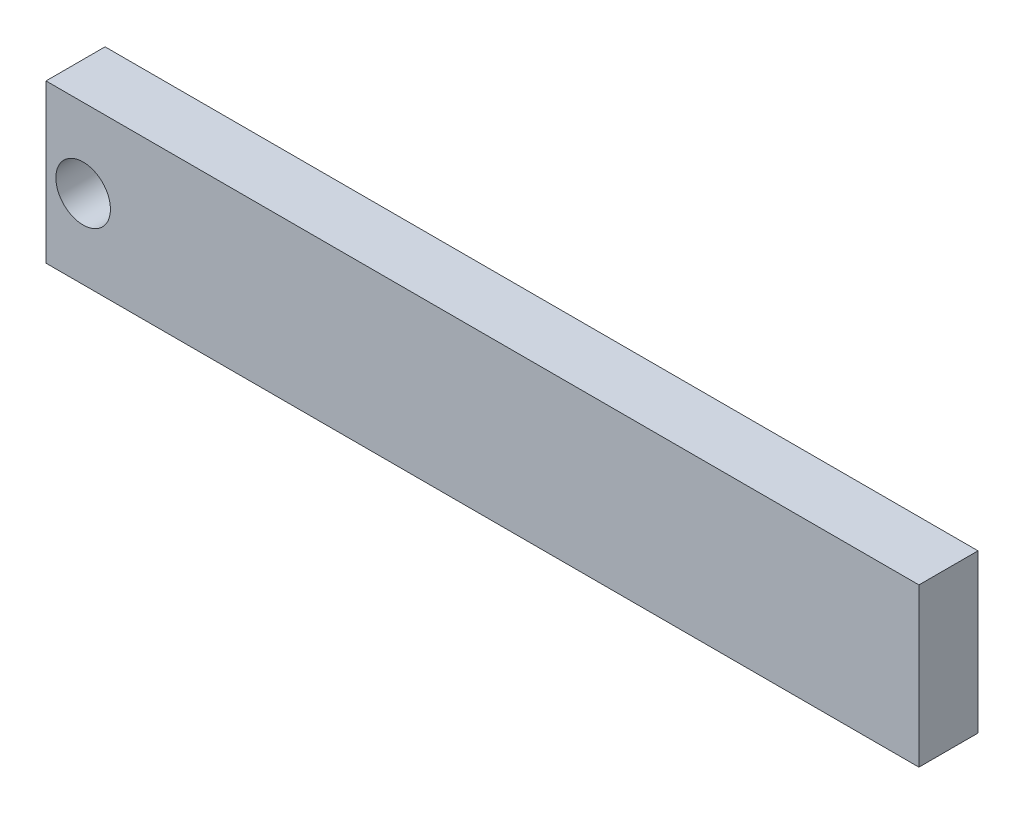
ISO-10303-21;
HEADER;
FILE_DESCRIPTION(('STEP AP214'),'2;1');
FILE_NAME('part.step','',(''),(''),'','','');
FILE_SCHEMA(('AUTOMOTIVE_DESIGN { 1 0 10303 214 1 1 1 1 }'));
ENDSEC;
DATA;
#1=APPLICATION_CONTEXT('core data for automotive mechanical design processes');
#2=APPLICATION_PROTOCOL_DEFINITION('international standard','automotive_design',2000,#1);
#3=PRODUCT_CONTEXT('',#1,'mechanical');
#4=PRODUCT('Part','Part','',(#3));
#5=PRODUCT_RELATED_PRODUCT_CATEGORY('part','',(#4));
#6=PRODUCT_DEFINITION_FORMATION('','',#4);
#7=PRODUCT_DEFINITION_CONTEXT('part definition',#1,'design');
#8=PRODUCT_DEFINITION('design','',#6,#7);
#9=PRODUCT_DEFINITION_SHAPE('','',#8);
#10=(LENGTH_UNIT() NAMED_UNIT(*) SI_UNIT(.MILLI.,.METRE.));
#11=(NAMED_UNIT(*) PLANE_ANGLE_UNIT() SI_UNIT($,.RADIAN.));
#12=(NAMED_UNIT(*) SI_UNIT($,.STERADIAN.) SOLID_ANGLE_UNIT());
#13=UNCERTAINTY_MEASURE_WITH_UNIT(LENGTH_MEASURE(1.E-05),#10,'distance_accuracy_value','');
#14=(GEOMETRIC_REPRESENTATION_CONTEXT(3) GLOBAL_UNCERTAINTY_ASSIGNED_CONTEXT((#13)) GLOBAL_UNIT_ASSIGNED_CONTEXT((#10,
#11,#12)) REPRESENTATION_CONTEXT('',''));
#15=CARTESIAN_POINT('',(0.,0.,0.));
#16=DIRECTION('',(0.,0.,1.));
#17=DIRECTION('',(1.,0.,0.));
#18=AXIS2_PLACEMENT_3D('',#15,#16,#17);
#19=CARTESIAN_POINT('',(0.,0.,3.18));
#20=DIRECTION('',(0.,0.,-1.));
#21=DIRECTION('',(-1.,0.,0.));
#22=AXIS2_PLACEMENT_3D('',#19,#20,#21);
#23=PLANE('',#22);
#24=DIRECTION('',(0.,-1.,0.));
#25=VECTOR('',#24,1.);
#26=CARTESIAN_POINT('',(0.,0.,3.18));
#27=LINE('',#26,#25);
#28=CARTESIAN_POINT('',(0.,8.5,3.18));
#29=VERTEX_POINT('',#28);
#30=CARTESIAN_POINT('',(0.,0.,3.18));
#31=VERTEX_POINT('',#30);
#32=EDGE_CURVE('E85',#29,#31,#27,.T.);
#33=ORIENTED_EDGE('',*,*,#32,.T.);
#34=DIRECTION('',(1.,0.,0.));
#35=VECTOR('',#34,1.);
#36=CARTESIAN_POINT('',(0.,0.,3.18));
#37=LINE('',#36,#35);
#38=CARTESIAN_POINT('',(47.,0.,3.18));
#39=VERTEX_POINT('',#38);
#40=EDGE_CURVE('E80',#31,#39,#37,.T.);
#41=ORIENTED_EDGE('',*,*,#40,.T.);
#42=DIRECTION('',(0.,1.,0.));
#43=VECTOR('',#42,1.);
#44=CARTESIAN_POINT('',(47.,0.,3.18));
#45=LINE('',#44,#43);
#46=CARTESIAN_POINT('',(47.,8.50000000000001,3.18));
#47=VERTEX_POINT('',#46);
#48=EDGE_CURVE('E83',#39,#47,#45,.T.);
#49=ORIENTED_EDGE('',*,*,#48,.T.);
#50=DIRECTION('',(-1.,0.,0.));
#51=VECTOR('',#50,1.);
#52=CARTESIAN_POINT('',(0.,8.5,3.18));
#53=LINE('',#52,#51);
#54=EDGE_CURVE('E50',#47,#29,#53,.T.);
#55=ORIENTED_EDGE('',*,*,#54,.T.);
#56=EDGE_LOOP('',(#33,#41,#49,#55));
#57=FACE_BOUND('',#56,.T.);
#58=CARTESIAN_POINT('',(2.,4.25,3.18));
#59=DIRECTION('',(0.,0.,1.));
#60=DIRECTION('',(1.,0.,0.));
#61=AXIS2_PLACEMENT_3D('',#58,#59,#60);
#62=CIRCLE('',#61,1.47);
#63=CARTESIAN_POINT('',(0.53,4.25,3.18));
#64=VERTEX_POINT('',#63);
#65=EDGE_CURVE('E100',#64,#64,#62,.T.);
#66=ORIENTED_EDGE('',*,*,#65,.F.);
#67=EDGE_LOOP('',(#66));
#68=FACE_BOUND('',#67,.T.);
#69=ADVANCED_FACE('F33',(#57,#68),#23,.F.);
#70=CARTESIAN_POINT('',(0.,0.,0.));
#71=DIRECTION('',(0.,0.,-1.));
#72=DIRECTION('',(-1.,0.,0.));
#73=AXIS2_PLACEMENT_3D('',#70,#71,#72);
#74=PLANE('',#73);
#75=DIRECTION('',(0.,-1.,0.));
#76=VECTOR('',#75,1.);
#77=CARTESIAN_POINT('',(0.,0.,0.));
#78=LINE('',#77,#76);
#79=CARTESIAN_POINT('',(0.,8.5,0.));
#80=VERTEX_POINT('',#79);
#81=CARTESIAN_POINT('',(0.,0.,0.));
#82=VERTEX_POINT('',#81);
#83=EDGE_CURVE('E97',#80,#82,#78,.T.);
#84=ORIENTED_EDGE('',*,*,#83,.F.);
#85=DIRECTION('',(-1.,0.,0.));
#86=VECTOR('',#85,1.);
#87=CARTESIAN_POINT('',(0.,8.5,0.));
#88=LINE('',#87,#86);
#89=CARTESIAN_POINT('',(47.,8.50000000000001,0.));
#90=VERTEX_POINT('',#89);
#91=EDGE_CURVE('E73',#90,#80,#88,.T.);
#92=ORIENTED_EDGE('',*,*,#91,.F.);
#93=DIRECTION('',(0.,1.,0.));
#94=VECTOR('',#93,1.);
#95=CARTESIAN_POINT('',(47.,0.,0.));
#96=LINE('',#95,#94);
#97=CARTESIAN_POINT('',(47.,0.,0.));
#98=VERTEX_POINT('',#97);
#99=EDGE_CURVE('E67',#98,#90,#96,.T.);
#100=ORIENTED_EDGE('',*,*,#99,.F.);
#101=DIRECTION('',(1.,0.,0.));
#102=VECTOR('',#101,1.);
#103=CARTESIAN_POINT('',(0.,0.,0.));
#104=LINE('',#103,#102);
#105=EDGE_CURVE('E89',#82,#98,#104,.T.);
#106=ORIENTED_EDGE('',*,*,#105,.F.);
#107=EDGE_LOOP('',(#84,#92,#100,#106));
#108=FACE_BOUND('',#107,.T.);
#109=CARTESIAN_POINT('',(2.,4.25,0.));
#110=DIRECTION('',(0.,0.,1.));
#111=DIRECTION('',(1.,0.,0.));
#112=AXIS2_PLACEMENT_3D('',#109,#110,#111);
#113=CIRCLE('',#112,1.47);
#114=CARTESIAN_POINT('',(0.53,4.25,0.));
#115=VERTEX_POINT('',#114);
#116=EDGE_CURVE('E112',#115,#115,#113,.T.);
#117=ORIENTED_EDGE('',*,*,#116,.T.);
#118=EDGE_LOOP('',(#117));
#119=FACE_BOUND('',#118,.T.);
#120=ADVANCED_FACE('F108',(#108,#119),#74,.T.);
#121=CARTESIAN_POINT('',(0.,0.,3.18));
#122=DIRECTION('',(1.,0.,0.));
#123=DIRECTION('',(0.,1.,0.));
#124=AXIS2_PLACEMENT_3D('',#121,#122,#123);
#125=PLANE('',#124);
#126=ORIENTED_EDGE('',*,*,#83,.T.);
#127=DIRECTION('',(0.,0.,-1.));
#128=VECTOR('',#127,1.);
#129=CARTESIAN_POINT('',(0.,0.,3.18));
#130=LINE('',#129,#128);
#131=EDGE_CURVE('E11',#31,#82,#130,.T.);
#132=ORIENTED_EDGE('',*,*,#131,.F.);
#133=ORIENTED_EDGE('',*,*,#32,.F.);
#134=DIRECTION('',(0.,0.,-1.));
#135=VECTOR('',#134,1.);
#136=CARTESIAN_POINT('',(0.,8.5,3.18));
#137=LINE('',#136,#135);
#138=EDGE_CURVE('E93',#29,#80,#137,.T.);
#139=ORIENTED_EDGE('',*,*,#138,.T.);
#140=EDGE_LOOP('',(#126,#132,#133,#139));
#141=FACE_BOUND('',#140,.T.);
#142=ADVANCED_FACE('F35',(#141),#125,.F.);
#143=CARTESIAN_POINT('',(0.,0.,3.18));
#144=DIRECTION('',(0.,1.,0.));
#145=DIRECTION('',(0.,0.,1.));
#146=AXIS2_PLACEMENT_3D('',#143,#144,#145);
#147=PLANE('',#146);
#148=ORIENTED_EDGE('',*,*,#105,.T.);
#149=DIRECTION('',(0.,0.,-1.));
#150=VECTOR('',#149,1.);
#151=CARTESIAN_POINT('',(47.,0.,3.18));
#152=LINE('',#151,#150);
#153=EDGE_CURVE('E42',#39,#98,#152,.T.);
#154=ORIENTED_EDGE('',*,*,#153,.F.);
#155=ORIENTED_EDGE('',*,*,#40,.F.);
#156=ORIENTED_EDGE('',*,*,#131,.T.);
#157=EDGE_LOOP('',(#148,#154,#155,#156));
#158=FACE_BOUND('',#157,.T.);
#159=ADVANCED_FACE('F88',(#158),#147,.F.);
#160=CARTESIAN_POINT('',(47.,0.,3.18));
#161=DIRECTION('',(-1.,0.,0.));
#162=DIRECTION('',(0.,0.,1.));
#163=AXIS2_PLACEMENT_3D('',#160,#161,#162);
#164=PLANE('',#163);
#165=ORIENTED_EDGE('',*,*,#99,.T.);
#166=DIRECTION('',(0.,0.,-1.));
#167=VECTOR('',#166,1.);
#168=CARTESIAN_POINT('',(47.,8.50000000000001,3.18));
#169=LINE('',#168,#167);
#170=EDGE_CURVE('E90',#47,#90,#169,.T.);
#171=ORIENTED_EDGE('',*,*,#170,.F.);
#172=ORIENTED_EDGE('',*,*,#48,.F.);
#173=ORIENTED_EDGE('',*,*,#153,.T.);
#174=EDGE_LOOP('',(#165,#171,#172,#173));
#175=FACE_BOUND('',#174,.T.);
#176=ADVANCED_FACE('F91',(#175),#164,.F.);
#177=CARTESIAN_POINT('',(0.,8.5,3.18));
#178=DIRECTION('',(0.,-1.,0.));
#179=DIRECTION('',(1.,0.,0.));
#180=AXIS2_PLACEMENT_3D('',#177,#178,#179);
#181=PLANE('',#180);
#182=ORIENTED_EDGE('',*,*,#91,.T.);
#183=ORIENTED_EDGE('',*,*,#138,.F.);
#184=ORIENTED_EDGE('',*,*,#54,.F.);
#185=ORIENTED_EDGE('',*,*,#170,.T.);
#186=EDGE_LOOP('',(#182,#183,#184,#185));
#187=FACE_BOUND('',#186,.T.);
#188=ADVANCED_FACE('F105',(#187),#181,.F.);
#189=CARTESIAN_POINT('',(2.,4.25,3.18));
#190=DIRECTION('',(0.,0.,-1.));
#191=DIRECTION('',(-1.,0.,0.));
#192=AXIS2_PLACEMENT_3D('',#189,#190,#191);
#193=CYLINDRICAL_SURFACE('',#192,1.47);
#194=CARTESIAN_POINT('',(0.53,4.25,3.18));
#195=CARTESIAN_POINT('',(0.53,4.25,3.146875));
#196=CARTESIAN_POINT('',(0.53,4.25,3.11375));
#197=CARTESIAN_POINT('',(0.53,4.25,3.0475));
#198=CARTESIAN_POINT('',(0.53,4.25,3.014375));
#199=CARTESIAN_POINT('',(0.53,4.25,2.948125));
#200=CARTESIAN_POINT('',(0.53,4.25,2.915));
#201=CARTESIAN_POINT('',(0.53,4.25,2.84875));
#202=CARTESIAN_POINT('',(0.53,4.25,2.815625));
#203=CARTESIAN_POINT('',(0.53,4.25,2.749375));
#204=CARTESIAN_POINT('',(0.53,4.25,2.71625));
#205=CARTESIAN_POINT('',(0.53,4.25,2.65));
#206=CARTESIAN_POINT('',(0.53,4.25,2.616875));
#207=CARTESIAN_POINT('',(0.53,4.25,2.550625));
#208=CARTESIAN_POINT('',(0.53,4.25,2.5175));
#209=CARTESIAN_POINT('',(0.53,4.25,2.45125));
#210=CARTESIAN_POINT('',(0.53,4.25,2.418125));
#211=CARTESIAN_POINT('',(0.53,4.25,2.351875));
#212=CARTESIAN_POINT('',(0.53,4.25,2.31875));
#213=CARTESIAN_POINT('',(0.53,4.25,2.2525));
#214=CARTESIAN_POINT('',(0.53,4.25,2.219375));
#215=CARTESIAN_POINT('',(0.53,4.25,2.153125));
#216=CARTESIAN_POINT('',(0.53,4.25,2.12));
#217=CARTESIAN_POINT('',(0.53,4.25,2.05375));
#218=CARTESIAN_POINT('',(0.53,4.25,2.020625));
#219=CARTESIAN_POINT('',(0.53,4.25,1.954375));
#220=CARTESIAN_POINT('',(0.53,4.25,1.92125));
#221=CARTESIAN_POINT('',(0.53,4.25,1.855));
#222=CARTESIAN_POINT('',(0.53,4.25,1.821875));
#223=CARTESIAN_POINT('',(0.53,4.25,1.755625));
#224=CARTESIAN_POINT('',(0.53,4.25,1.7225));
#225=CARTESIAN_POINT('',(0.53,4.25,1.65625));
#226=CARTESIAN_POINT('',(0.53,4.25,1.623125));
#227=CARTESIAN_POINT('',(0.53,4.25,1.556875));
#228=CARTESIAN_POINT('',(0.53,4.25,1.52375));
#229=CARTESIAN_POINT('',(0.53,4.25,1.4575));
#230=CARTESIAN_POINT('',(0.53,4.25,1.424375));
#231=CARTESIAN_POINT('',(0.53,4.25,1.358125));
#232=CARTESIAN_POINT('',(0.53,4.25,1.325));
#233=CARTESIAN_POINT('',(0.53,4.25,1.25875));
#234=CARTESIAN_POINT('',(0.53,4.25,1.225625));
#235=CARTESIAN_POINT('',(0.53,4.25,1.159375));
#236=CARTESIAN_POINT('',(0.53,4.25,1.12625));
#237=CARTESIAN_POINT('',(0.53,4.25,1.06));
#238=CARTESIAN_POINT('',(0.53,4.25,1.026875));
#239=CARTESIAN_POINT('',(0.53,4.25,0.960625));
#240=CARTESIAN_POINT('',(0.53,4.25,0.9275));
#241=CARTESIAN_POINT('',(0.53,4.25,0.86125));
#242=CARTESIAN_POINT('',(0.53,4.25,0.828125));
#243=CARTESIAN_POINT('',(0.53,4.25,0.761875));
#244=CARTESIAN_POINT('',(0.53,4.25,0.72875));
#245=CARTESIAN_POINT('',(0.53,4.25,0.6625));
#246=CARTESIAN_POINT('',(0.53,4.25,0.629375));
#247=CARTESIAN_POINT('',(0.53,4.25,0.563125));
#248=CARTESIAN_POINT('',(0.53,4.25,0.53));
#249=CARTESIAN_POINT('',(0.53,4.25,0.46375));
#250=CARTESIAN_POINT('',(0.53,4.25,0.430625));
#251=CARTESIAN_POINT('',(0.53,4.25,0.364375));
#252=CARTESIAN_POINT('',(0.53,4.25,0.33125));
#253=CARTESIAN_POINT('',(0.53,4.25,0.265));
#254=CARTESIAN_POINT('',(0.53,4.25,0.231875));
#255=CARTESIAN_POINT('',(0.53,4.25,0.165625));
#256=CARTESIAN_POINT('',(0.53,4.25,0.1325));
#257=CARTESIAN_POINT('',(0.53,4.25,0.06625));
#258=CARTESIAN_POINT('',(0.53,4.25,0.033125));
#259=CARTESIAN_POINT('',(0.53,4.25,0.));
#260=B_SPLINE_CURVE_WITH_KNOTS('',3,(#194,#195,#196,#197,#198,#199,#200,#201,#202,#203,#204,
#205,#206,#207,#208,#209,#210,#211,#212,#213,#214,#215,#216,#217,#218,#219,#220,#221,#222,#223,
#224,#225,#226,#227,#228,#229,#230,#231,#232,#233,#234,#235,#236,#237,#238,#239,#240,#241,#242,
#243,#244,#245,#246,#247,#248,#249,#250,#251,#252,#253,#254,#255,#256,#257,#258,#259),
.UNSPECIFIED.,.F.,.F.,(4,2,2,2,2,2,2,2,2,2,2,2,2,2,2,2,2,2,2,2,2,2,2,2,2,2,2,2,2,2,2,2,4),(0.,
0.0993750000000001,0.19875,0.298125,0.3975,0.496875,0.59625,0.695625,0.795,0.894375,0.99375,
1.093125,1.1925,1.291875,1.39125,1.490625,1.59,1.689375,1.78875,1.888125,1.9875,2.086875,
2.18625,2.285625,2.385,2.484375,2.58375,2.683125,2.7825,2.881875,2.98125,3.080625,3.18),.UNSPECIFIED.);
#261=EDGE_CURVE('BSEAM118',#64,#115,#260,.T.);
#262=ORIENTED_EDGE('',*,*,#65,.T.);
#263=ORIENTED_EDGE('',*,*,#116,.F.);
#264=ORIENTED_EDGE('',*,*,#261,.T.);
#265=ORIENTED_EDGE('',*,*,#261,.F.);
#266=EDGE_LOOP('',(#262,#264,#263,#265));
#267=FACE_BOUND('',#266,.T.);
#268=ADVANCED_FACE('F118',(#267),#193,.F.);
#269=CLOSED_SHELL('',(#69,#120,#142,#159,#176,#188,#268));
#270=MANIFOLD_SOLID_BREP('B2',#269);
#271=ADVANCED_BREP_SHAPE_REPRESENTATION('',(#18,#270),#14);
#272=SHAPE_DEFINITION_REPRESENTATION(#9,#271);
ENDSEC;
END-ISO-10303-21;
